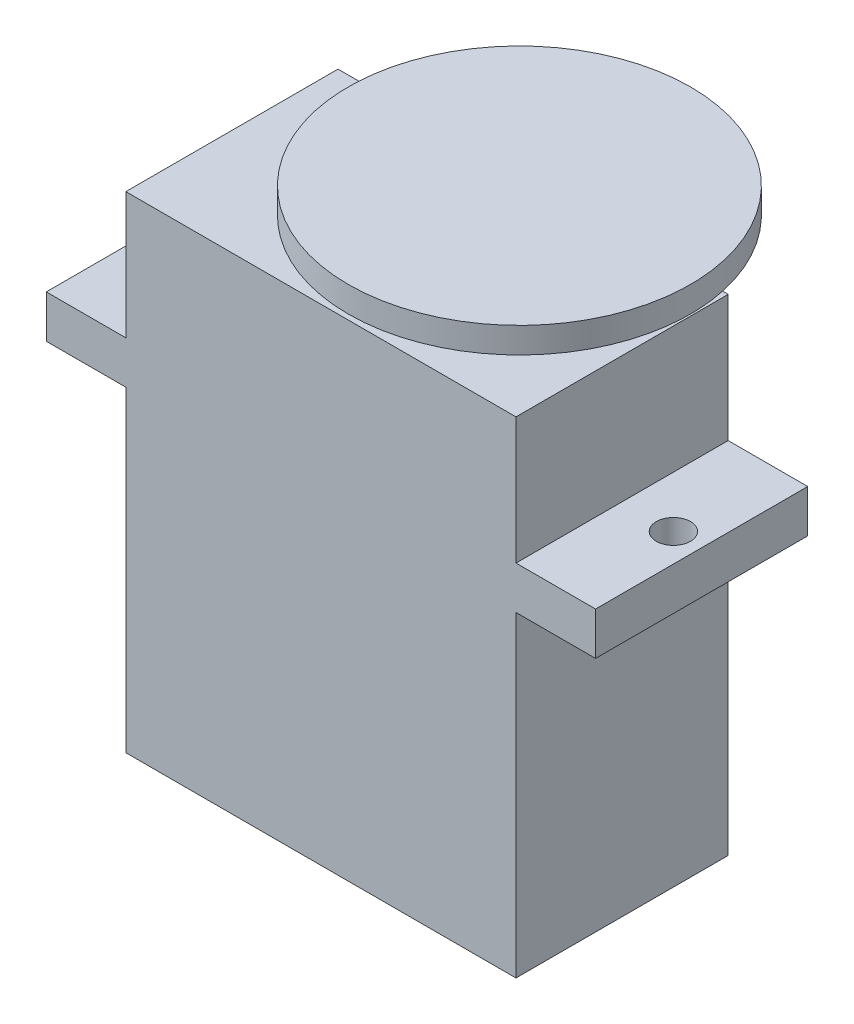
ISO-10303-21;
HEADER;
FILE_DESCRIPTION(('STEP AP214'),'2;1');
FILE_NAME('part.step','',(''),(''),'','','');
FILE_SCHEMA(('AUTOMOTIVE_DESIGN { 1 0 10303 214 1 1 1 1 }'));
ENDSEC;
DATA;
#1=APPLICATION_CONTEXT('core data for automotive mechanical design processes');
#2=APPLICATION_PROTOCOL_DEFINITION('international standard','automotive_design',2000,#1);
#3=PRODUCT_CONTEXT('',#1,'mechanical');
#4=PRODUCT('Part','Part','',(#3));
#5=PRODUCT_RELATED_PRODUCT_CATEGORY('part','',(#4));
#6=PRODUCT_DEFINITION_FORMATION('','',#4);
#7=PRODUCT_DEFINITION_CONTEXT('part definition',#1,'design');
#8=PRODUCT_DEFINITION('design','',#6,#7);
#9=PRODUCT_DEFINITION_SHAPE('','',#8);
#10=(LENGTH_UNIT() NAMED_UNIT(*) SI_UNIT(.MILLI.,.METRE.));
#11=(NAMED_UNIT(*) PLANE_ANGLE_UNIT() SI_UNIT($,.RADIAN.));
#12=(NAMED_UNIT(*) SI_UNIT($,.STERADIAN.) SOLID_ANGLE_UNIT());
#13=UNCERTAINTY_MEASURE_WITH_UNIT(LENGTH_MEASURE(1.E-05),#10,'distance_accuracy_value','');
#14=(GEOMETRIC_REPRESENTATION_CONTEXT(3) GLOBAL_UNCERTAINTY_ASSIGNED_CONTEXT((#13)) GLOBAL_UNIT_ASSIGNED_CONTEXT((#10,
#11,#12)) REPRESENTATION_CONTEXT('',''));
#15=CARTESIAN_POINT('',(0.,0.,0.));
#16=DIRECTION('',(0.,0.,1.));
#17=DIRECTION('',(1.,0.,0.));
#18=AXIS2_PLACEMENT_3D('',#15,#16,#17);
#19=CARTESIAN_POINT('',(0.,9.9,0.));
#20=DIRECTION('',(0.,-1.,0.));
#21=DIRECTION('',(0.,0.,-1.));
#22=AXIS2_PLACEMENT_3D('',#19,#20,#21);
#23=PLANE('',#22);
#24=DIRECTION('',(0.,0.,-1.));
#25=VECTOR('',#24,1.);
#26=CARTESIAN_POINT('',(11.4,9.9,6.2));
#27=LINE('',#26,#25);
#28=CARTESIAN_POINT('',(11.4,9.9,6.2));
#29=VERTEX_POINT('',#28);
#30=CARTESIAN_POINT('',(11.4,9.9,-6.2));
#31=VERTEX_POINT('',#30);
#32=EDGE_CURVE('E139',#29,#31,#27,.T.);
#33=ORIENTED_EDGE('',*,*,#32,.T.);
#34=DIRECTION('',(-1.,0.,0.));
#35=VECTOR('',#34,1.);
#36=CARTESIAN_POINT('',(-11.4,9.9,-6.2));
#37=LINE('',#36,#35);
#38=CARTESIAN_POINT('',(-11.4,9.9,-6.2));
#39=VERTEX_POINT('',#38);
#40=EDGE_CURVE('E128',#31,#39,#37,.T.);
#41=ORIENTED_EDGE('',*,*,#40,.T.);
#42=DIRECTION('',(0.,0.,1.));
#43=VECTOR('',#42,1.);
#44=CARTESIAN_POINT('',(-11.4,9.9,6.2));
#45=LINE('',#44,#43);
#46=CARTESIAN_POINT('',(-11.4,9.9,6.2));
#47=VERTEX_POINT('',#46);
#48=EDGE_CURVE('E138',#39,#47,#45,.T.);
#49=ORIENTED_EDGE('',*,*,#48,.T.);
#50=DIRECTION('',(1.,0.,0.));
#51=VECTOR('',#50,1.);
#52=CARTESIAN_POINT('',(-11.4,9.9,6.2));
#53=LINE('',#52,#51);
#54=EDGE_CURVE('E144',#47,#29,#53,.T.);
#55=ORIENTED_EDGE('',*,*,#54,.T.);
#56=EDGE_LOOP('',(#33,#41,#49,#55));
#57=FACE_BOUND('',#56,.T.);
#58=CARTESIAN_POINT('',(5.4,9.9,0.));
#59=DIRECTION('',(0.,-1.,0.));
#60=DIRECTION('',(0.,0.,-1.));
#61=AXIS2_PLACEMENT_3D('',#58,#59,#60);
#62=CIRCLE('',#61,2.5);
#63=CARTESIAN_POINT('',(5.4,9.9,-2.5));
#64=VERTEX_POINT('',#63);
#65=EDGE_CURVE('E11',#64,#64,#62,.F.);
#66=ORIENTED_EDGE('',*,*,#65,.F.);
#67=EDGE_LOOP('',(#66));
#68=FACE_BOUND('',#67,.T.);
#69=ADVANCED_FACE('F37',(#57,#68),#23,.F.);
#70=CARTESIAN_POINT('',(0.,2.5,0.));
#71=DIRECTION('',(0.,-1.,0.));
#72=DIRECTION('',(0.,0.,-1.));
#73=AXIS2_PLACEMENT_3D('',#70,#71,#72);
#74=PLANE('',#73);
#75=CARTESIAN_POINT('',(14.4,2.5,0.));
#76=DIRECTION('',(0.,1.,0.));
#77=DIRECTION('',(0.,0.,-1.));
#78=AXIS2_PLACEMENT_3D('',#75,#76,#77);
#79=CIRCLE('',#78,1.);
#80=CARTESIAN_POINT('',(14.4,2.5,-1.00000000000001));
#81=VERTEX_POINT('',#80);
#82=EDGE_CURVE('E194',#81,#81,#79,.T.);
#83=ORIENTED_EDGE('',*,*,#82,.F.);
#84=EDGE_LOOP('',(#83));
#85=FACE_BOUND('',#84,.T.);
#86=DIRECTION('',(0.,0.,-1.));
#87=VECTOR('',#86,1.);
#88=CARTESIAN_POINT('',(11.4,2.5,6.2));
#89=LINE('',#88,#87);
#90=CARTESIAN_POINT('',(11.4,2.5,6.2));
#91=VERTEX_POINT('',#90);
#92=CARTESIAN_POINT('',(11.4,2.5,-6.2));
#93=VERTEX_POINT('',#92);
#94=EDGE_CURVE('E54',#91,#93,#89,.T.);
#95=ORIENTED_EDGE('',*,*,#94,.F.);
#96=DIRECTION('',(1.,0.,0.));
#97=VECTOR('',#96,1.);
#98=CARTESIAN_POINT('',(-16.05,2.5,6.2));
#99=LINE('',#98,#97);
#100=CARTESIAN_POINT('',(16.05,2.5,6.2));
#101=VERTEX_POINT('',#100);
#102=EDGE_CURVE('E178',#91,#101,#99,.T.);
#103=ORIENTED_EDGE('',*,*,#102,.T.);
#104=DIRECTION('',(0.,0.,-1.));
#105=VECTOR('',#104,1.);
#106=CARTESIAN_POINT('',(16.05,2.5,6.2));
#107=LINE('',#106,#105);
#108=CARTESIAN_POINT('',(16.05,2.5,-6.2));
#109=VERTEX_POINT('',#108);
#110=EDGE_CURVE('E324',#101,#109,#107,.T.);
#111=ORIENTED_EDGE('',*,*,#110,.T.);
#112=DIRECTION('',(-1.,0.,0.));
#113=VECTOR('',#112,1.);
#114=CARTESIAN_POINT('',(-16.05,2.5,-6.2));
#115=LINE('',#114,#113);
#116=EDGE_CURVE('E319',#109,#93,#115,.T.);
#117=ORIENTED_EDGE('',*,*,#116,.T.);
#118=EDGE_LOOP('',(#95,#103,#111,#117));
#119=FACE_BOUND('',#118,.T.);
#120=ADVANCED_FACE('F227',(#85,#119),#74,.F.);
#121=CARTESIAN_POINT('',(-14.4,2.5,0.));
#122=DIRECTION('',(0.,1.,0.));
#123=DIRECTION('',(0.,0.,1.));
#124=AXIS2_PLACEMENT_3D('',#121,#122,#123);
#125=CIRCLE('',#124,1.);
#126=CARTESIAN_POINT('',(-14.4,2.5,1.));
#127=VERTEX_POINT('',#126);
#128=EDGE_CURVE('E191',#127,#127,#125,.T.);
#129=ORIENTED_EDGE('',*,*,#128,.F.);
#130=EDGE_LOOP('',(#129));
#131=FACE_BOUND('',#130,.T.);
#132=DIRECTION('',(0.,0.,1.));
#133=VECTOR('',#132,1.);
#134=CARTESIAN_POINT('',(-11.4,2.5,6.2));
#135=LINE('',#134,#133);
#136=CARTESIAN_POINT('',(-11.4,2.5,-6.2));
#137=VERTEX_POINT('',#136);
#138=CARTESIAN_POINT('',(-11.4,2.5,6.2));
#139=VERTEX_POINT('',#138);
#140=EDGE_CURVE('E62',#137,#139,#135,.T.);
#141=ORIENTED_EDGE('',*,*,#140,.F.);
#142=CARTESIAN_POINT('',(-16.05,2.5,-6.2));
#143=VERTEX_POINT('',#142);
#144=EDGE_CURVE('E322',#137,#143,#115,.T.);
#145=ORIENTED_EDGE('',*,*,#144,.T.);
#146=DIRECTION('',(0.,0.,1.));
#147=VECTOR('',#146,1.);
#148=CARTESIAN_POINT('',(-16.05,2.5,6.2));
#149=LINE('',#148,#147);
#150=CARTESIAN_POINT('',(-16.05,2.5,6.2));
#151=VERTEX_POINT('',#150);
#152=EDGE_CURVE('E321',#143,#151,#149,.T.);
#153=ORIENTED_EDGE('',*,*,#152,.T.);
#154=EDGE_CURVE('E312',#151,#139,#99,.T.);
#155=ORIENTED_EDGE('',*,*,#154,.T.);
#156=EDGE_LOOP('',(#141,#145,#153,#155));
#157=FACE_BOUND('',#156,.T.);
#158=ADVANCED_FACE('F232',(#131,#157),#74,.F.);
#159=CARTESIAN_POINT('',(0.,0.,0.));
#160=DIRECTION('',(0.,-1.,0.));
#161=DIRECTION('',(0.,0.,-1.));
#162=AXIS2_PLACEMENT_3D('',#159,#160,#161);
#163=PLANE('',#162);
#164=CARTESIAN_POINT('',(14.4,0.,0.));
#165=DIRECTION('',(0.,-1.,0.));
#166=DIRECTION('',(0.,0.,-1.));
#167=AXIS2_PLACEMENT_3D('',#164,#165,#166);
#168=CIRCLE('',#167,1.);
#169=CARTESIAN_POINT('',(14.4,0.,-1.00000000000001));
#170=VERTEX_POINT('',#169);
#171=EDGE_CURVE('E41',#170,#170,#168,.T.);
#172=ORIENTED_EDGE('',*,*,#171,.F.);
#173=EDGE_LOOP('',(#172));
#174=FACE_BOUND('',#173,.T.);
#175=DIRECTION('',(0.,0.,1.));
#176=VECTOR('',#175,1.);
#177=CARTESIAN_POINT('',(11.4,0.,-6.2));
#178=LINE('',#177,#176);
#179=CARTESIAN_POINT('',(11.4,0.,-6.2));
#180=VERTEX_POINT('',#179);
#181=CARTESIAN_POINT('',(11.4,0.,6.2));
#182=VERTEX_POINT('',#181);
#183=EDGE_CURVE('E150',#180,#182,#178,.T.);
#184=ORIENTED_EDGE('',*,*,#183,.F.);
#185=DIRECTION('',(-1.,0.,0.));
#186=VECTOR('',#185,1.);
#187=CARTESIAN_POINT('',(-16.05,0.,-6.2));
#188=LINE('',#187,#186);
#189=CARTESIAN_POINT('',(16.05,0.,-6.2));
#190=VERTEX_POINT('',#189);
#191=EDGE_CURVE('E287',#190,#180,#188,.T.);
#192=ORIENTED_EDGE('',*,*,#191,.F.);
#193=DIRECTION('',(0.,0.,-1.));
#194=VECTOR('',#193,1.);
#195=CARTESIAN_POINT('',(16.05,0.,6.2));
#196=LINE('',#195,#194);
#197=CARTESIAN_POINT('',(16.05,0.,6.2));
#198=VERTEX_POINT('',#197);
#199=EDGE_CURVE('E278',#198,#190,#196,.T.);
#200=ORIENTED_EDGE('',*,*,#199,.F.);
#201=DIRECTION('',(1.,0.,0.));
#202=VECTOR('',#201,1.);
#203=CARTESIAN_POINT('',(-16.05,0.,6.2));
#204=LINE('',#203,#202);
#205=EDGE_CURVE('E303',#182,#198,#204,.T.);
#206=ORIENTED_EDGE('',*,*,#205,.F.);
#207=EDGE_LOOP('',(#184,#192,#200,#206));
#208=FACE_BOUND('',#207,.T.);
#209=ADVANCED_FACE('F259',(#174,#208),#163,.T.);
#210=CARTESIAN_POINT('',(16.05,2.5,6.2));
#211=DIRECTION('',(-1.,0.,0.));
#212=DIRECTION('',(0.,0.,1.));
#213=AXIS2_PLACEMENT_3D('',#210,#211,#212);
#214=PLANE('',#213);
#215=ORIENTED_EDGE('',*,*,#199,.T.);
#216=DIRECTION('',(0.,-1.,0.));
#217=VECTOR('',#216,1.);
#218=CARTESIAN_POINT('',(16.05,2.5,-6.2));
#219=LINE('',#218,#217);
#220=EDGE_CURVE('E46',#109,#190,#219,.T.);
#221=ORIENTED_EDGE('',*,*,#220,.F.);
#222=ORIENTED_EDGE('',*,*,#110,.F.);
#223=DIRECTION('',(0.,-1.,0.));
#224=VECTOR('',#223,1.);
#225=CARTESIAN_POINT('',(16.05,2.5,6.2));
#226=LINE('',#225,#224);
#227=EDGE_CURVE('E282',#101,#198,#226,.T.);
#228=ORIENTED_EDGE('',*,*,#227,.T.);
#229=EDGE_LOOP('',(#215,#221,#222,#228));
#230=FACE_BOUND('',#229,.T.);
#231=ADVANCED_FACE('F39',(#230),#214,.F.);
#232=CARTESIAN_POINT('',(-16.05,2.5,-6.2));
#233=DIRECTION('',(0.,0.,1.));
#234=DIRECTION('',(1.,0.,0.));
#235=AXIS2_PLACEMENT_3D('',#232,#233,#234);
#236=PLANE('',#235);
#237=ORIENTED_EDGE('',*,*,#191,.T.);
#238=DIRECTION('',(0.,1.,0.));
#239=VECTOR('',#238,1.);
#240=CARTESIAN_POINT('',(11.4,-18.5,-6.2));
#241=LINE('',#240,#239);
#242=CARTESIAN_POINT('',(11.4,-18.5,-6.2));
#243=VERTEX_POINT('',#242);
#244=EDGE_CURVE('E337',#243,#180,#241,.T.);
#245=ORIENTED_EDGE('',*,*,#244,.F.);
#246=DIRECTION('',(1.,0.,0.));
#247=VECTOR('',#246,1.);
#248=CARTESIAN_POINT('',(-11.4,-18.5,-6.2));
#249=LINE('',#248,#247);
#250=CARTESIAN_POINT('',(-11.4,-18.5,-6.2));
#251=VERTEX_POINT('',#250);
#252=EDGE_CURVE('E339',#251,#243,#249,.T.);
#253=ORIENTED_EDGE('',*,*,#252,.F.);
#254=DIRECTION('',(0.,1.,0.));
#255=VECTOR('',#254,1.);
#256=CARTESIAN_POINT('',(-11.4,-18.5,-6.2));
#257=LINE('',#256,#255);
#258=CARTESIAN_POINT('',(-11.4,0.,-6.2));
#259=VERTEX_POINT('',#258);
#260=EDGE_CURVE('E338',#251,#259,#257,.T.);
#261=ORIENTED_EDGE('',*,*,#260,.T.);
#262=CARTESIAN_POINT('',(-16.05,0.,-6.2));
#263=VERTEX_POINT('',#262);
#264=EDGE_CURVE('E284',#259,#263,#188,.T.);
#265=ORIENTED_EDGE('',*,*,#264,.T.);
#266=DIRECTION('',(0.,-1.,0.));
#267=VECTOR('',#266,1.);
#268=CARTESIAN_POINT('',(-16.05,2.5,-6.2));
#269=LINE('',#268,#267);
#270=EDGE_CURVE('E315',#143,#263,#269,.T.);
#271=ORIENTED_EDGE('',*,*,#270,.F.);
#272=ORIENTED_EDGE('',*,*,#144,.F.);
#273=DIRECTION('',(0.,-1.,0.));
#274=VECTOR('',#273,1.);
#275=CARTESIAN_POINT('',(-11.4,9.9,-6.2));
#276=LINE('',#275,#274);
#277=EDGE_CURVE('E135',#39,#137,#276,.T.);
#278=ORIENTED_EDGE('',*,*,#277,.F.);
#279=ORIENTED_EDGE('',*,*,#40,.F.);
#280=DIRECTION('',(0.,-1.,0.));
#281=VECTOR('',#280,1.);
#282=CARTESIAN_POINT('',(11.4,9.9,-6.2));
#283=LINE('',#282,#281);
#284=EDGE_CURVE('E133',#31,#93,#283,.T.);
#285=ORIENTED_EDGE('',*,*,#284,.T.);
#286=ORIENTED_EDGE('',*,*,#116,.F.);
#287=ORIENTED_EDGE('',*,*,#220,.T.);
#288=EDGE_LOOP('',(#237,#245,#253,#261,#265,#271,#272,#278,#279,#285,#286,#287));
#289=FACE_BOUND('',#288,.T.);
#290=ADVANCED_FACE('F131',(#289),#236,.F.);
#291=CARTESIAN_POINT('',(-16.05,2.5,6.2));
#292=DIRECTION('',(1.,0.,0.));
#293=DIRECTION('',(0.,0.,-1.));
#294=AXIS2_PLACEMENT_3D('',#291,#292,#293);
#295=PLANE('',#294);
#296=DIRECTION('',(0.,0.,1.));
#297=VECTOR('',#296,1.);
#298=CARTESIAN_POINT('',(-16.05,0.,6.2));
#299=LINE('',#298,#297);
#300=CARTESIAN_POINT('',(-16.05,0.,6.2));
#301=VERTEX_POINT('',#300);
#302=EDGE_CURVE('E297',#263,#301,#299,.T.);
#303=ORIENTED_EDGE('',*,*,#302,.T.);
#304=DIRECTION('',(0.,-1.,0.));
#305=VECTOR('',#304,1.);
#306=CARTESIAN_POINT('',(-16.05,2.5,6.2));
#307=LINE('',#306,#305);
#308=EDGE_CURVE('E311',#151,#301,#307,.T.);
#309=ORIENTED_EDGE('',*,*,#308,.F.);
#310=ORIENTED_EDGE('',*,*,#152,.F.);
#311=ORIENTED_EDGE('',*,*,#270,.T.);
#312=EDGE_LOOP('',(#303,#309,#310,#311));
#313=FACE_BOUND('',#312,.T.);
#314=ADVANCED_FACE('F262',(#313),#295,.F.);
#315=CARTESIAN_POINT('',(-16.05,2.5,6.2));
#316=DIRECTION('',(0.,0.,-1.));
#317=DIRECTION('',(-1.,0.,0.));
#318=AXIS2_PLACEMENT_3D('',#315,#316,#317);
#319=PLANE('',#318);
#320=CARTESIAN_POINT('',(-11.4,0.,6.2));
#321=VERTEX_POINT('',#320);
#322=EDGE_CURVE('E305',#301,#321,#204,.T.);
#323=ORIENTED_EDGE('',*,*,#322,.T.);
#324=DIRECTION('',(0.,1.,0.));
#325=VECTOR('',#324,1.);
#326=CARTESIAN_POINT('',(-11.4,-18.5,6.2));
#327=LINE('',#326,#325);
#328=CARTESIAN_POINT('',(-11.4,-18.5,6.2));
#329=VERTEX_POINT('',#328);
#330=EDGE_CURVE('E290',#329,#321,#327,.T.);
#331=ORIENTED_EDGE('',*,*,#330,.F.);
#332=DIRECTION('',(-1.,0.,0.));
#333=VECTOR('',#332,1.);
#334=CARTESIAN_POINT('',(-11.4,-18.5,6.2));
#335=LINE('',#334,#333);
#336=CARTESIAN_POINT('',(11.4,-18.5,6.2));
#337=VERTEX_POINT('',#336);
#338=EDGE_CURVE('E346',#337,#329,#335,.T.);
#339=ORIENTED_EDGE('',*,*,#338,.F.);
#340=DIRECTION('',(0.,1.,0.));
#341=VECTOR('',#340,1.);
#342=CARTESIAN_POINT('',(11.4,-18.5,6.2));
#343=LINE('',#342,#341);
#344=EDGE_CURVE('E285',#337,#182,#343,.T.);
#345=ORIENTED_EDGE('',*,*,#344,.T.);
#346=ORIENTED_EDGE('',*,*,#205,.T.);
#347=ORIENTED_EDGE('',*,*,#227,.F.);
#348=ORIENTED_EDGE('',*,*,#102,.F.);
#349=DIRECTION('',(0.,-1.,0.));
#350=VECTOR('',#349,1.);
#351=CARTESIAN_POINT('',(11.4,9.9,6.2));
#352=LINE('',#351,#350);
#353=EDGE_CURVE('E165',#29,#91,#352,.T.);
#354=ORIENTED_EDGE('',*,*,#353,.F.);
#355=ORIENTED_EDGE('',*,*,#54,.F.);
#356=DIRECTION('',(0.,-1.,0.));
#357=VECTOR('',#356,1.);
#358=CARTESIAN_POINT('',(-11.4,9.9,6.2));
#359=LINE('',#358,#357);
#360=EDGE_CURVE('E155',#47,#139,#359,.T.);
#361=ORIENTED_EDGE('',*,*,#360,.T.);
#362=ORIENTED_EDGE('',*,*,#154,.F.);
#363=ORIENTED_EDGE('',*,*,#308,.T.);
#364=EDGE_LOOP('',(#323,#331,#339,#345,#346,#347,#348,#354,#355,#361,#362,#363));
#365=FACE_BOUND('',#364,.T.);
#366=ADVANCED_FACE('F257',(#365),#319,.F.);
#367=CARTESIAN_POINT('',(-14.4,0.,0.));
#368=DIRECTION('',(0.,-1.,0.));
#369=DIRECTION('',(0.,0.,-1.));
#370=AXIS2_PLACEMENT_3D('',#367,#368,#369);
#371=CIRCLE('',#370,1.);
#372=CARTESIAN_POINT('',(-14.4,0.,-1.));
#373=VERTEX_POINT('',#372);
#374=EDGE_CURVE('E190',#373,#373,#371,.T.);
#375=ORIENTED_EDGE('',*,*,#374,.F.);
#376=EDGE_LOOP('',(#375));
#377=FACE_BOUND('',#376,.T.);
#378=DIRECTION('',(0.,0.,-1.));
#379=VECTOR('',#378,1.);
#380=CARTESIAN_POINT('',(-11.4,0.,-6.2));
#381=LINE('',#380,#379);
#382=EDGE_CURVE('E153',#321,#259,#381,.T.);
#383=ORIENTED_EDGE('',*,*,#382,.F.);
#384=ORIENTED_EDGE('',*,*,#322,.F.);
#385=ORIENTED_EDGE('',*,*,#302,.F.);
#386=ORIENTED_EDGE('',*,*,#264,.F.);
#387=EDGE_LOOP('',(#383,#384,#385,#386));
#388=FACE_BOUND('',#387,.T.);
#389=ADVANCED_FACE('F252',(#377,#388),#163,.T.);
#390=CARTESIAN_POINT('',(11.4,-18.5,-6.2));
#391=DIRECTION('',(-1.,0.,0.));
#392=DIRECTION('',(0.,0.,1.));
#393=AXIS2_PLACEMENT_3D('',#390,#391,#392);
#394=PLANE('',#393);
#395=ORIENTED_EDGE('',*,*,#183,.T.);
#396=ORIENTED_EDGE('',*,*,#344,.F.);
#397=DIRECTION('',(0.,0.,1.));
#398=VECTOR('',#397,1.);
#399=CARTESIAN_POINT('',(11.4,-18.5,-6.2));
#400=LINE('',#399,#398);
#401=EDGE_CURVE('E173',#243,#337,#400,.T.);
#402=ORIENTED_EDGE('',*,*,#401,.F.);
#403=ORIENTED_EDGE('',*,*,#244,.T.);
#404=EDGE_LOOP('',(#395,#396,#402,#403));
#405=FACE_BOUND('',#404,.T.);
#406=ADVANCED_FACE('F249',(#405),#394,.F.);
#407=CARTESIAN_POINT('',(-11.4,-18.5,-6.2));
#408=DIRECTION('',(1.,0.,0.));
#409=DIRECTION('',(0.,0.,-1.));
#410=AXIS2_PLACEMENT_3D('',#407,#408,#409);
#411=PLANE('',#410);
#412=ORIENTED_EDGE('',*,*,#382,.T.);
#413=ORIENTED_EDGE('',*,*,#260,.F.);
#414=DIRECTION('',(0.,0.,-1.));
#415=VECTOR('',#414,1.);
#416=CARTESIAN_POINT('',(-11.4,-18.5,-6.2));
#417=LINE('',#416,#415);
#418=EDGE_CURVE('E345',#329,#251,#417,.T.);
#419=ORIENTED_EDGE('',*,*,#418,.F.);
#420=ORIENTED_EDGE('',*,*,#330,.T.);
#421=EDGE_LOOP('',(#412,#413,#419,#420));
#422=FACE_BOUND('',#421,.T.);
#423=ADVANCED_FACE('F245',(#422),#411,.F.);
#424=CARTESIAN_POINT('',(0.,-18.5,0.));
#425=DIRECTION('',(0.,1.,0.));
#426=DIRECTION('',(0.,0.,1.));
#427=AXIS2_PLACEMENT_3D('',#424,#425,#426);
#428=PLANE('',#427);
#429=ORIENTED_EDGE('',*,*,#401,.T.);
#430=ORIENTED_EDGE('',*,*,#338,.T.);
#431=ORIENTED_EDGE('',*,*,#418,.T.);
#432=ORIENTED_EDGE('',*,*,#252,.T.);
#433=EDGE_LOOP('',(#429,#430,#431,#432));
#434=FACE_BOUND('',#433,.T.);
#435=ADVANCED_FACE('F242',(#434),#428,.F.);
#436=CARTESIAN_POINT('',(11.4,9.9,6.2));
#437=DIRECTION('',(-1.,0.,0.));
#438=DIRECTION('',(0.,0.,1.));
#439=AXIS2_PLACEMENT_3D('',#436,#437,#438);
#440=PLANE('',#439);
#441=ORIENTED_EDGE('',*,*,#94,.T.);
#442=ORIENTED_EDGE('',*,*,#284,.F.);
#443=ORIENTED_EDGE('',*,*,#32,.F.);
#444=ORIENTED_EDGE('',*,*,#353,.T.);
#445=EDGE_LOOP('',(#441,#442,#443,#444));
#446=FACE_BOUND('',#445,.T.);
#447=ADVANCED_FACE('F149',(#446),#440,.F.);
#448=CARTESIAN_POINT('',(-11.4,9.9,6.2));
#449=DIRECTION('',(1.,0.,0.));
#450=DIRECTION('',(0.,0.,-1.));
#451=AXIS2_PLACEMENT_3D('',#448,#449,#450);
#452=PLANE('',#451);
#453=ORIENTED_EDGE('',*,*,#140,.T.);
#454=ORIENTED_EDGE('',*,*,#360,.F.);
#455=ORIENTED_EDGE('',*,*,#48,.F.);
#456=ORIENTED_EDGE('',*,*,#277,.T.);
#457=EDGE_LOOP('',(#453,#454,#455,#456));
#458=FACE_BOUND('',#457,.T.);
#459=ADVANCED_FACE('F223',(#458),#452,.F.);
#460=CARTESIAN_POINT('',(5.4,14.,0.));
#461=DIRECTION('',(0.,-1.,0.));
#462=DIRECTION('',(0.,0.,-1.));
#463=AXIS2_PLACEMENT_3D('',#460,#461,#462);
#464=CYLINDRICAL_SURFACE('',#463,2.5);
#465=CARTESIAN_POINT('',(5.4,14.,0.));
#466=DIRECTION('',(0.,1.,0.));
#467=DIRECTION('',(0.,0.,1.));
#468=AXIS2_PLACEMENT_3D('',#465,#466,#467);
#469=CIRCLE('',#468,2.5);
#470=CARTESIAN_POINT('',(5.4,14.,2.5));
#471=VERTEX_POINT('',#470);
#472=EDGE_CURVE('E164',#471,#471,#469,.T.);
#473=ORIENTED_EDGE('',*,*,#472,.F.);
#474=EDGE_LOOP('',(#473));
#475=FACE_BOUND('',#474,.T.);
#476=ORIENTED_EDGE('',*,*,#65,.T.);
#477=EDGE_LOOP('',(#476));
#478=FACE_BOUND('',#477,.T.);
#479=ADVANCED_FACE('F219',(#475,#478),#464,.T.);
#480=CARTESIAN_POINT('',(-14.4,-18.500025,0.));
#481=DIRECTION('',(0.,1.,0.));
#482=DIRECTION('',(0.,0.,1.));
#483=AXIS2_PLACEMENT_3D('',#480,#481,#482);
#484=CYLINDRICAL_SURFACE('',#483,1.);
#485=ORIENTED_EDGE('',*,*,#374,.T.);
#486=EDGE_LOOP('',(#485));
#487=FACE_BOUND('',#486,.T.);
#488=ORIENTED_EDGE('',*,*,#128,.T.);
#489=EDGE_LOOP('',(#488));
#490=FACE_BOUND('',#489,.T.);
#491=ADVANCED_FACE('F222',(#487,#490),#484,.F.);
#492=CARTESIAN_POINT('',(14.4,-18.500025,0.));
#493=DIRECTION('',(0.,1.,0.));
#494=DIRECTION('',(0.,0.,1.));
#495=AXIS2_PLACEMENT_3D('',#492,#493,#494);
#496=CYLINDRICAL_SURFACE('',#495,1.);
#497=ORIENTED_EDGE('',*,*,#171,.T.);
#498=EDGE_LOOP('',(#497));
#499=FACE_BOUND('',#498,.T.);
#500=ORIENTED_EDGE('',*,*,#82,.T.);
#501=EDGE_LOOP('',(#500));
#502=FACE_BOUND('',#501,.T.);
#503=ADVANCED_FACE('F215',(#499,#502),#496,.F.);
#504=CARTESIAN_POINT('',(5.4,14.,0.));
#505=DIRECTION('',(0.,1.,0.));
#506=DIRECTION('',(0.,0.,1.));
#507=AXIS2_PLACEMENT_3D('',#504,#505,#506);
#508=PLANE('',#507);
#509=CARTESIAN_POINT('',(5.4,14.,0.));
#510=DIRECTION('',(0.,1.,0.));
#511=DIRECTION('',(0.,0.,1.));
#512=AXIS2_PLACEMENT_3D('',#509,#510,#511);
#513=CIRCLE('',#512,10.);
#514=CARTESIAN_POINT('',(5.4,14.,10.));
#515=VERTEX_POINT('',#514);
#516=EDGE_CURVE('E198',#515,#515,#513,.T.);
#517=ORIENTED_EDGE('',*,*,#516,.F.);
#518=EDGE_LOOP('',(#517));
#519=FACE_BOUND('',#518,.T.);
#520=ORIENTED_EDGE('',*,*,#472,.T.);
#521=EDGE_LOOP('',(#520));
#522=FACE_BOUND('',#521,.T.);
#523=ADVANCED_FACE('F209',(#519,#522),#508,.F.);
#524=CARTESIAN_POINT('',(5.4,15.5,0.));
#525=DIRECTION('',(0.,-1.,0.));
#526=DIRECTION('',(0.,0.,-1.));
#527=AXIS2_PLACEMENT_3D('',#524,#525,#526);
#528=CYLINDRICAL_SURFACE('',#527,10.);
#529=CARTESIAN_POINT('',(5.4,15.5,0.));
#530=DIRECTION('',(0.,1.,0.));
#531=DIRECTION('',(0.,0.,1.));
#532=AXIS2_PLACEMENT_3D('',#529,#530,#531);
#533=CIRCLE('',#532,10.);
#534=CARTESIAN_POINT('',(5.4,15.5,10.));
#535=VERTEX_POINT('',#534);
#536=EDGE_CURVE('E197',#535,#535,#533,.T.);
#537=ORIENTED_EDGE('',*,*,#536,.F.);
#538=EDGE_LOOP('',(#537));
#539=FACE_BOUND('',#538,.T.);
#540=ORIENTED_EDGE('',*,*,#516,.T.);
#541=EDGE_LOOP('',(#540));
#542=FACE_BOUND('',#541,.T.);
#543=ADVANCED_FACE('F206',(#539,#542),#528,.T.);
#544=CARTESIAN_POINT('',(5.4,15.5,0.));
#545=DIRECTION('',(0.,1.,0.));
#546=DIRECTION('',(0.,0.,1.));
#547=AXIS2_PLACEMENT_3D('',#544,#545,#546);
#548=PLANE('',#547);
#549=ORIENTED_EDGE('',*,*,#536,.T.);
#550=EDGE_LOOP('',(#549));
#551=FACE_BOUND('',#550,.T.);
#552=ADVANCED_FACE('F204',(#551),#548,.T.);
#553=CLOSED_SHELL('',(#69,#120,#158,#209,#231,#290,#314,#366,#389,#406,#423,#435,#447,#459,#479,
#491,#503,#523,#543,#552));
#554=MANIFOLD_SOLID_BREP('B2',#553);
#555=ADVANCED_BREP_SHAPE_REPRESENTATION('',(#18,#554),#14);
#556=SHAPE_DEFINITION_REPRESENTATION(#9,#555);
ENDSEC;
END-ISO-10303-21;
